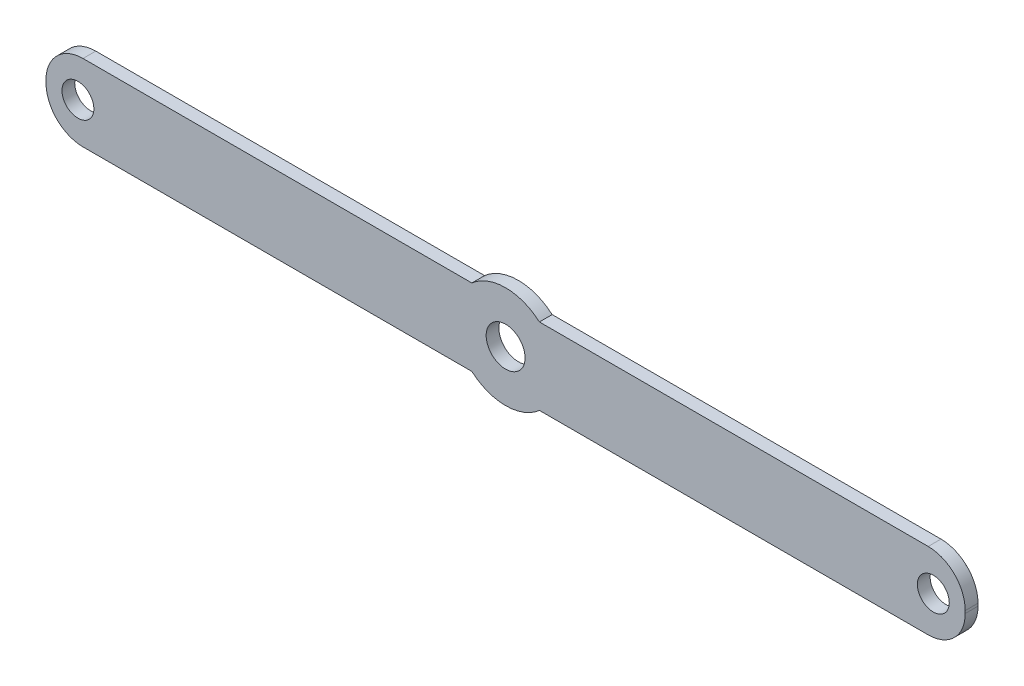
ISO-10303-21;
HEADER;
FILE_DESCRIPTION(('STEP AP214'),'2;1');
FILE_NAME('part.step','',(''),(''),'','','');
FILE_SCHEMA(('AUTOMOTIVE_DESIGN { 1 0 10303 214 1 1 1 1 }'));
ENDSEC;
DATA;
#1=APPLICATION_CONTEXT('core data for automotive mechanical design processes');
#2=APPLICATION_PROTOCOL_DEFINITION('international standard','automotive_design',2000,#1);
#3=PRODUCT_CONTEXT('',#1,'mechanical');
#4=PRODUCT('Part','Part','',(#3));
#5=PRODUCT_RELATED_PRODUCT_CATEGORY('part','',(#4));
#6=PRODUCT_DEFINITION_FORMATION('','',#4);
#7=PRODUCT_DEFINITION_CONTEXT('part definition',#1,'design');
#8=PRODUCT_DEFINITION('design','',#6,#7);
#9=PRODUCT_DEFINITION_SHAPE('','',#8);
#10=(LENGTH_UNIT() NAMED_UNIT(*) SI_UNIT(.MILLI.,.METRE.));
#11=(NAMED_UNIT(*) PLANE_ANGLE_UNIT() SI_UNIT($,.RADIAN.));
#12=(NAMED_UNIT(*) SI_UNIT($,.STERADIAN.) SOLID_ANGLE_UNIT());
#13=UNCERTAINTY_MEASURE_WITH_UNIT(LENGTH_MEASURE(1.E-05),#10,'distance_accuracy_value','');
#14=(GEOMETRIC_REPRESENTATION_CONTEXT(3) GLOBAL_UNCERTAINTY_ASSIGNED_CONTEXT((#13)) GLOBAL_UNIT_ASSIGNED_CONTEXT((#10,
#11,#12)) REPRESENTATION_CONTEXT('',''));
#15=CARTESIAN_POINT('',(0.,0.,0.));
#16=DIRECTION('',(0.,0.,1.));
#17=DIRECTION('',(1.,0.,0.));
#18=AXIS2_PLACEMENT_3D('',#15,#16,#17);
#19=CARTESIAN_POINT('',(360.,-30.,-10.));
#20=DIRECTION('',(0.,0.,1.));
#21=DIRECTION('',(1.,0.,0.));
#22=AXIS2_PLACEMENT_3D('',#19,#20,#21);
#23=CYLINDRICAL_SURFACE('',#22,40.);
#24=CARTESIAN_POINT('',(360.,-30.,0.));
#25=DIRECTION('',(0.,0.,1.));
#26=DIRECTION('',(-1.,0.,0.));
#27=AXIS2_PLACEMENT_3D('',#24,#25,#26);
#28=CIRCLE('',#27,40.);
#29=CARTESIAN_POINT('',(386.457513110646,0.,0.));
#30=VERTEX_POINT('',#29);
#31=CARTESIAN_POINT('',(333.542486889354,0.,0.));
#32=VERTEX_POINT('',#31);
#33=EDGE_CURVE('E160',#30,#32,#28,.T.);
#34=ORIENTED_EDGE('',*,*,#33,.F.);
#35=DIRECTION('',(0.,0.,1.));
#36=VECTOR('',#35,1.);
#37=CARTESIAN_POINT('',(386.457513110646,0.,-10.));
#38=LINE('',#37,#36);
#39=CARTESIAN_POINT('',(386.457513110646,0.,-10.));
#40=VERTEX_POINT('',#39);
#41=EDGE_CURVE('E11',#40,#30,#38,.T.);
#42=ORIENTED_EDGE('',*,*,#41,.F.);
#43=CARTESIAN_POINT('',(360.,-30.,-10.));
#44=DIRECTION('',(0.,0.,1.));
#45=DIRECTION('',(-1.,0.,0.));
#46=AXIS2_PLACEMENT_3D('',#43,#44,#45);
#47=CIRCLE('',#46,40.);
#48=CARTESIAN_POINT('',(333.542486889354,0.,-10.));
#49=VERTEX_POINT('',#48);
#50=EDGE_CURVE('E193',#40,#49,#47,.T.);
#51=ORIENTED_EDGE('',*,*,#50,.T.);
#52=DIRECTION('',(0.,0.,1.));
#53=VECTOR('',#52,1.);
#54=CARTESIAN_POINT('',(333.542486889354,0.,-10.));
#55=LINE('',#54,#53);
#56=EDGE_CURVE('E42',#49,#32,#55,.T.);
#57=ORIENTED_EDGE('',*,*,#56,.T.);
#58=EDGE_LOOP('',(#34,#42,#51,#57));
#59=FACE_BOUND('',#58,.T.);
#60=ADVANCED_FACE('F39',(#59),#23,.T.);
#61=CARTESIAN_POINT('',(386.457513110646,0.,-10.));
#62=DIRECTION('',(0.,1.,0.));
#63=DIRECTION('',(-1.,0.,0.));
#64=AXIS2_PLACEMENT_3D('',#61,#62,#63);
#65=PLANE('',#64);
#66=DIRECTION('',(-1.,0.,0.));
#67=VECTOR('',#66,1.);
#68=CARTESIAN_POINT('',(386.457513110646,0.,0.));
#69=LINE('',#68,#67);
#70=CARTESIAN_POINT('',(691.,0.,0.));
#71=VERTEX_POINT('',#70);
#72=EDGE_CURVE('E191',#71,#30,#69,.T.);
#73=ORIENTED_EDGE('',*,*,#72,.F.);
#74=DIRECTION('',(0.,0.,1.));
#75=VECTOR('',#74,1.);
#76=CARTESIAN_POINT('',(691.,0.,-10.));
#77=LINE('',#76,#75);
#78=CARTESIAN_POINT('',(691.,0.,-10.));
#79=VERTEX_POINT('',#78);
#80=EDGE_CURVE('E48',#79,#71,#77,.T.);
#81=ORIENTED_EDGE('',*,*,#80,.F.);
#82=DIRECTION('',(-1.,0.,0.));
#83=VECTOR('',#82,1.);
#84=CARTESIAN_POINT('',(386.457513110646,0.,-10.));
#85=LINE('',#84,#83);
#86=EDGE_CURVE('E150',#79,#40,#85,.T.);
#87=ORIENTED_EDGE('',*,*,#86,.T.);
#88=ORIENTED_EDGE('',*,*,#41,.T.);
#89=EDGE_LOOP('',(#73,#81,#87,#88));
#90=FACE_BOUND('',#89,.T.);
#91=ADVANCED_FACE('F213',(#90),#65,.T.);
#92=CARTESIAN_POINT('',(691.,-29.,-10.));
#93=DIRECTION('',(0.,0.,1.));
#94=DIRECTION('',(1.,0.,0.));
#95=AXIS2_PLACEMENT_3D('',#92,#93,#94);
#96=CYLINDRICAL_SURFACE('',#95,29.);
#97=CARTESIAN_POINT('',(691.,-29.,0.));
#98=DIRECTION('',(0.,0.,1.));
#99=DIRECTION('',(-1.,0.,0.));
#100=AXIS2_PLACEMENT_3D('',#97,#98,#99);
#101=CIRCLE('',#100,29.);
#102=CARTESIAN_POINT('',(720.,-29.,0.));
#103=VERTEX_POINT('',#102);
#104=EDGE_CURVE('E137',#103,#71,#101,.T.);
#105=ORIENTED_EDGE('',*,*,#104,.F.);
#106=DIRECTION('',(0.,0.,1.));
#107=VECTOR('',#106,1.);
#108=CARTESIAN_POINT('',(720.,-29.,-10.));
#109=LINE('',#108,#107);
#110=CARTESIAN_POINT('',(720.,-29.,-10.));
#111=VERTEX_POINT('',#110);
#112=EDGE_CURVE('E132',#111,#103,#109,.T.);
#113=ORIENTED_EDGE('',*,*,#112,.F.);
#114=CARTESIAN_POINT('',(691.,-29.,-10.));
#115=DIRECTION('',(0.,0.,1.));
#116=DIRECTION('',(-1.,0.,0.));
#117=AXIS2_PLACEMENT_3D('',#114,#115,#116);
#118=CIRCLE('',#117,29.);
#119=EDGE_CURVE('E135',#111,#79,#118,.T.);
#120=ORIENTED_EDGE('',*,*,#119,.T.);
#121=ORIENTED_EDGE('',*,*,#80,.T.);
#122=EDGE_LOOP('',(#105,#113,#120,#121));
#123=FACE_BOUND('',#122,.T.);
#124=ADVANCED_FACE('F134',(#123),#96,.T.);
#125=CARTESIAN_POINT('',(720.,-29.,-10.));
#126=DIRECTION('',(1.,0.,0.));
#127=DIRECTION('',(0.,0.,-1.));
#128=AXIS2_PLACEMENT_3D('',#125,#126,#127);
#129=PLANE('',#128);
#130=DIRECTION('',(0.,1.,0.));
#131=VECTOR('',#130,1.);
#132=CARTESIAN_POINT('',(720.,-29.,0.));
#133=LINE('',#132,#131);
#134=CARTESIAN_POINT('',(720.,-31.,0.));
#135=VERTEX_POINT('',#134);
#136=EDGE_CURVE('E188',#135,#103,#133,.T.);
#137=ORIENTED_EDGE('',*,*,#136,.F.);
#138=DIRECTION('',(0.,0.,1.));
#139=VECTOR('',#138,1.);
#140=CARTESIAN_POINT('',(720.,-31.,-10.));
#141=LINE('',#140,#139);
#142=CARTESIAN_POINT('',(720.,-31.,-10.));
#143=VERTEX_POINT('',#142);
#144=EDGE_CURVE('E142',#143,#135,#141,.T.);
#145=ORIENTED_EDGE('',*,*,#144,.F.);
#146=DIRECTION('',(0.,1.,0.));
#147=VECTOR('',#146,1.);
#148=CARTESIAN_POINT('',(720.,-29.,-10.));
#149=LINE('',#148,#147);
#150=EDGE_CURVE('E148',#143,#111,#149,.T.);
#151=ORIENTED_EDGE('',*,*,#150,.T.);
#152=ORIENTED_EDGE('',*,*,#112,.T.);
#153=EDGE_LOOP('',(#137,#145,#151,#152));
#154=FACE_BOUND('',#153,.T.);
#155=ADVANCED_FACE('F152',(#154),#129,.T.);
#156=CARTESIAN_POINT('',(691.,-31.,-10.));
#157=DIRECTION('',(0.,0.,1.));
#158=DIRECTION('',(1.,0.,0.));
#159=AXIS2_PLACEMENT_3D('',#156,#157,#158);
#160=CYLINDRICAL_SURFACE('',#159,29.);
#161=CARTESIAN_POINT('',(691.,-31.,0.));
#162=DIRECTION('',(0.,0.,1.));
#163=DIRECTION('',(1.,0.,0.));
#164=AXIS2_PLACEMENT_3D('',#161,#162,#163);
#165=CIRCLE('',#164,29.);
#166=CARTESIAN_POINT('',(691.,-60.,0.));
#167=VERTEX_POINT('',#166);
#168=EDGE_CURVE('E185',#167,#135,#165,.T.);
#169=ORIENTED_EDGE('',*,*,#168,.F.);
#170=DIRECTION('',(0.,0.,1.));
#171=VECTOR('',#170,1.);
#172=CARTESIAN_POINT('',(691.,-60.,-10.));
#173=LINE('',#172,#171);
#174=CARTESIAN_POINT('',(691.,-60.,-10.));
#175=VERTEX_POINT('',#174);
#176=EDGE_CURVE('E197',#175,#167,#173,.T.);
#177=ORIENTED_EDGE('',*,*,#176,.F.);
#178=CARTESIAN_POINT('',(691.,-31.,-10.));
#179=DIRECTION('',(0.,0.,1.));
#180=DIRECTION('',(1.,0.,0.));
#181=AXIS2_PLACEMENT_3D('',#178,#179,#180);
#182=CIRCLE('',#181,29.);
#183=EDGE_CURVE('E153',#175,#143,#182,.T.);
#184=ORIENTED_EDGE('',*,*,#183,.T.);
#185=ORIENTED_EDGE('',*,*,#144,.T.);
#186=EDGE_LOOP('',(#169,#177,#184,#185));
#187=FACE_BOUND('',#186,.T.);
#188=ADVANCED_FACE('F226',(#187),#160,.T.);
#189=CARTESIAN_POINT('',(386.457513110646,-60.,-10.));
#190=DIRECTION('',(0.,-1.,0.));
#191=DIRECTION('',(1.,0.,0.));
#192=AXIS2_PLACEMENT_3D('',#189,#190,#191);
#193=PLANE('',#192);
#194=DIRECTION('',(1.,0.,0.));
#195=VECTOR('',#194,1.);
#196=CARTESIAN_POINT('',(386.457513110646,-60.,0.));
#197=LINE('',#196,#195);
#198=CARTESIAN_POINT('',(386.457513110646,-60.,0.));
#199=VERTEX_POINT('',#198);
#200=EDGE_CURVE('E182',#199,#167,#197,.T.);
#201=ORIENTED_EDGE('',*,*,#200,.F.);
#202=DIRECTION('',(0.,0.,1.));
#203=VECTOR('',#202,1.);
#204=CARTESIAN_POINT('',(386.457513110646,-60.,-10.));
#205=LINE('',#204,#203);
#206=CARTESIAN_POINT('',(386.457513110646,-60.,-10.));
#207=VERTEX_POINT('',#206);
#208=EDGE_CURVE('E199',#207,#199,#205,.T.);
#209=ORIENTED_EDGE('',*,*,#208,.F.);
#210=DIRECTION('',(1.,0.,0.));
#211=VECTOR('',#210,1.);
#212=CARTESIAN_POINT('',(386.457513110646,-60.,-10.));
#213=LINE('',#212,#211);
#214=EDGE_CURVE('E155',#207,#175,#213,.T.);
#215=ORIENTED_EDGE('',*,*,#214,.T.);
#216=ORIENTED_EDGE('',*,*,#176,.T.);
#217=EDGE_LOOP('',(#201,#209,#215,#216));
#218=FACE_BOUND('',#217,.T.);
#219=ADVANCED_FACE('F229',(#218),#193,.T.);
#220=CARTESIAN_POINT('',(360.,-30.,-10.));
#221=DIRECTION('',(0.,0.,1.));
#222=DIRECTION('',(1.,0.,0.));
#223=AXIS2_PLACEMENT_3D('',#220,#221,#222);
#224=CYLINDRICAL_SURFACE('',#223,40.);
#225=CARTESIAN_POINT('',(360.,-30.,0.));
#226=DIRECTION('',(0.,0.,1.));
#227=DIRECTION('',(1.,0.,0.));
#228=AXIS2_PLACEMENT_3D('',#225,#226,#227);
#229=CIRCLE('',#228,40.);
#230=CARTESIAN_POINT('',(333.542486889354,-60.,0.));
#231=VERTEX_POINT('',#230);
#232=EDGE_CURVE('E179',#231,#199,#229,.T.);
#233=ORIENTED_EDGE('',*,*,#232,.F.);
#234=DIRECTION('',(0.,0.,1.));
#235=VECTOR('',#234,1.);
#236=CARTESIAN_POINT('',(333.542486889354,-60.,-10.));
#237=LINE('',#236,#235);
#238=CARTESIAN_POINT('',(333.542486889354,-60.,-10.));
#239=VERTEX_POINT('',#238);
#240=EDGE_CURVE('E201',#239,#231,#237,.T.);
#241=ORIENTED_EDGE('',*,*,#240,.F.);
#242=CARTESIAN_POINT('',(360.,-30.,-10.));
#243=DIRECTION('',(0.,0.,1.));
#244=DIRECTION('',(1.,0.,0.));
#245=AXIS2_PLACEMENT_3D('',#242,#243,#244);
#246=CIRCLE('',#245,40.);
#247=EDGE_CURVE('E313',#239,#207,#246,.T.);
#248=ORIENTED_EDGE('',*,*,#247,.T.);
#249=ORIENTED_EDGE('',*,*,#208,.T.);
#250=EDGE_LOOP('',(#233,#241,#248,#249));
#251=FACE_BOUND('',#250,.T.);
#252=ADVANCED_FACE('F233',(#251),#224,.T.);
#253=CARTESIAN_POINT('',(29.0000000000002,-60.,-10.));
#254=DIRECTION('',(0.,-1.,0.));
#255=DIRECTION('',(1.,0.,0.));
#256=AXIS2_PLACEMENT_3D('',#253,#254,#255);
#257=PLANE('',#256);
#258=DIRECTION('',(1.,0.,0.));
#259=VECTOR('',#258,1.);
#260=CARTESIAN_POINT('',(29.0000000000002,-60.,0.));
#261=LINE('',#260,#259);
#262=CARTESIAN_POINT('',(29.0000000000002,-60.,0.));
#263=VERTEX_POINT('',#262);
#264=EDGE_CURVE('E176',#263,#231,#261,.T.);
#265=ORIENTED_EDGE('',*,*,#264,.F.);
#266=DIRECTION('',(0.,0.,1.));
#267=VECTOR('',#266,1.);
#268=CARTESIAN_POINT('',(29.0000000000002,-60.,-10.));
#269=LINE('',#268,#267);
#270=CARTESIAN_POINT('',(29.0000000000002,-60.,-10.));
#271=VERTEX_POINT('',#270);
#272=EDGE_CURVE('E203',#271,#263,#269,.T.);
#273=ORIENTED_EDGE('',*,*,#272,.F.);
#274=DIRECTION('',(1.,0.,0.));
#275=VECTOR('',#274,1.);
#276=CARTESIAN_POINT('',(29.0000000000002,-60.,-10.));
#277=LINE('',#276,#275);
#278=EDGE_CURVE('E310',#271,#239,#277,.T.);
#279=ORIENTED_EDGE('',*,*,#278,.T.);
#280=ORIENTED_EDGE('',*,*,#240,.T.);
#281=EDGE_LOOP('',(#265,#273,#279,#280));
#282=FACE_BOUND('',#281,.T.);
#283=ADVANCED_FACE('F237',(#282),#257,.T.);
#284=CARTESIAN_POINT('',(29.,-31.,-10.));
#285=DIRECTION('',(0.,0.,1.));
#286=DIRECTION('',(1.,0.,0.));
#287=AXIS2_PLACEMENT_3D('',#284,#285,#286);
#288=CYLINDRICAL_SURFACE('',#287,29.);
#289=CARTESIAN_POINT('',(29.,-31.,0.));
#290=DIRECTION('',(0.,0.,1.));
#291=DIRECTION('',(-1.,0.,0.));
#292=AXIS2_PLACEMENT_3D('',#289,#290,#291);
#293=CIRCLE('',#292,29.);
#294=CARTESIAN_POINT('',(0.,-30.9999999999998,0.));
#295=VERTEX_POINT('',#294);
#296=EDGE_CURVE('E173',#295,#263,#293,.T.);
#297=ORIENTED_EDGE('',*,*,#296,.F.);
#298=DIRECTION('',(0.,0.,1.));
#299=VECTOR('',#298,1.);
#300=CARTESIAN_POINT('',(0.,-30.9999999999998,-10.));
#301=LINE('',#300,#299);
#302=CARTESIAN_POINT('',(0.,-30.9999999999998,-10.));
#303=VERTEX_POINT('',#302);
#304=EDGE_CURVE('E205',#303,#295,#301,.T.);
#305=ORIENTED_EDGE('',*,*,#304,.F.);
#306=CARTESIAN_POINT('',(29.,-31.,-10.));
#307=DIRECTION('',(0.,0.,1.));
#308=DIRECTION('',(-1.,0.,0.));
#309=AXIS2_PLACEMENT_3D('',#306,#307,#308);
#310=CIRCLE('',#309,29.);
#311=EDGE_CURVE('E307',#303,#271,#310,.T.);
#312=ORIENTED_EDGE('',*,*,#311,.T.);
#313=ORIENTED_EDGE('',*,*,#272,.T.);
#314=EDGE_LOOP('',(#297,#305,#312,#313));
#315=FACE_BOUND('',#314,.T.);
#316=ADVANCED_FACE('F241',(#315),#288,.T.);
#317=CARTESIAN_POINT('',(0.,-29.0000000000002,-10.));
#318=DIRECTION('',(-1.,0.,0.));
#319=DIRECTION('',(0.,0.,1.));
#320=AXIS2_PLACEMENT_3D('',#317,#318,#319);
#321=PLANE('',#320);
#322=DIRECTION('',(0.,-1.,0.));
#323=VECTOR('',#322,1.);
#324=CARTESIAN_POINT('',(0.,-29.0000000000002,0.));
#325=LINE('',#324,#323);
#326=CARTESIAN_POINT('',(0.,-29.0000000000002,0.));
#327=VERTEX_POINT('',#326);
#328=EDGE_CURVE('E170',#327,#295,#325,.T.);
#329=ORIENTED_EDGE('',*,*,#328,.F.);
#330=DIRECTION('',(0.,0.,1.));
#331=VECTOR('',#330,1.);
#332=CARTESIAN_POINT('',(0.,-29.0000000000002,-10.));
#333=LINE('',#332,#331);
#334=CARTESIAN_POINT('',(0.,-29.0000000000002,-10.));
#335=VERTEX_POINT('',#334);
#336=EDGE_CURVE('E207',#335,#327,#333,.T.);
#337=ORIENTED_EDGE('',*,*,#336,.F.);
#338=DIRECTION('',(0.,-1.,0.));
#339=VECTOR('',#338,1.);
#340=CARTESIAN_POINT('',(0.,-29.0000000000002,-10.));
#341=LINE('',#340,#339);
#342=EDGE_CURVE('E304',#335,#303,#341,.T.);
#343=ORIENTED_EDGE('',*,*,#342,.T.);
#344=ORIENTED_EDGE('',*,*,#304,.T.);
#345=EDGE_LOOP('',(#329,#337,#343,#344));
#346=FACE_BOUND('',#345,.T.);
#347=ADVANCED_FACE('F245',(#346),#321,.T.);
#348=CARTESIAN_POINT('',(29.,-29.,-10.));
#349=DIRECTION('',(0.,0.,1.));
#350=DIRECTION('',(1.,0.,0.));
#351=AXIS2_PLACEMENT_3D('',#348,#349,#350);
#352=CYLINDRICAL_SURFACE('',#351,29.);
#353=CARTESIAN_POINT('',(29.,-29.,0.));
#354=DIRECTION('',(0.,0.,1.));
#355=DIRECTION('',(1.,0.,0.));
#356=AXIS2_PLACEMENT_3D('',#353,#354,#355);
#357=CIRCLE('',#356,29.);
#358=CARTESIAN_POINT('',(29.0000000000002,0.,0.));
#359=VERTEX_POINT('',#358);
#360=EDGE_CURVE('E167',#359,#327,#357,.T.);
#361=ORIENTED_EDGE('',*,*,#360,.F.);
#362=DIRECTION('',(0.,0.,1.));
#363=VECTOR('',#362,1.);
#364=CARTESIAN_POINT('',(29.0000000000002,0.,-10.));
#365=LINE('',#364,#363);
#366=CARTESIAN_POINT('',(29.0000000000002,0.,-10.));
#367=VERTEX_POINT('',#366);
#368=EDGE_CURVE('E208',#367,#359,#365,.T.);
#369=ORIENTED_EDGE('',*,*,#368,.F.);
#370=CARTESIAN_POINT('',(29.,-29.,-10.));
#371=DIRECTION('',(0.,0.,1.));
#372=DIRECTION('',(1.,0.,0.));
#373=AXIS2_PLACEMENT_3D('',#370,#371,#372);
#374=CIRCLE('',#373,29.);
#375=EDGE_CURVE('E301',#367,#335,#374,.T.);
#376=ORIENTED_EDGE('',*,*,#375,.T.);
#377=ORIENTED_EDGE('',*,*,#336,.T.);
#378=EDGE_LOOP('',(#361,#369,#376,#377));
#379=FACE_BOUND('',#378,.T.);
#380=ADVANCED_FACE('F249',(#379),#352,.T.);
#381=CARTESIAN_POINT('',(29.0000000000002,0.,-10.));
#382=DIRECTION('',(0.,1.,0.));
#383=DIRECTION('',(0.,0.,1.));
#384=AXIS2_PLACEMENT_3D('',#381,#382,#383);
#385=PLANE('',#384);
#386=DIRECTION('',(-1.,0.,0.));
#387=VECTOR('',#386,1.);
#388=CARTESIAN_POINT('',(29.0000000000002,0.,0.));
#389=LINE('',#388,#387);
#390=EDGE_CURVE('E163',#32,#359,#389,.T.);
#391=ORIENTED_EDGE('',*,*,#390,.F.);
#392=ORIENTED_EDGE('',*,*,#56,.F.);
#393=DIRECTION('',(-1.,0.,0.));
#394=VECTOR('',#393,1.);
#395=CARTESIAN_POINT('',(29.0000000000002,0.,-10.));
#396=LINE('',#395,#394);
#397=EDGE_CURVE('E299',#49,#367,#396,.T.);
#398=ORIENTED_EDGE('',*,*,#397,.T.);
#399=ORIENTED_EDGE('',*,*,#368,.T.);
#400=EDGE_LOOP('',(#391,#392,#398,#399));
#401=FACE_BOUND('',#400,.T.);
#402=ADVANCED_FACE('F210',(#401),#385,.T.);
#403=CARTESIAN_POINT('',(360.,-30.,-10.));
#404=DIRECTION('',(0.,0.,-1.));
#405=DIRECTION('',(-1.,0.,0.));
#406=AXIS2_PLACEMENT_3D('',#403,#404,#405);
#407=PLANE('',#406);
#408=CARTESIAN_POINT('',(25.,-30.0000000000001,-10.));
#409=DIRECTION('',(0.,0.,1.));
#410=DIRECTION('',(-1.,0.,0.));
#411=AXIS2_PLACEMENT_3D('',#408,#409,#410);
#412=CIRCLE('',#411,12.5);
#413=CARTESIAN_POINT('',(12.5,-30.0000000000001,-10.));
#414=VERTEX_POINT('',#413);
#415=EDGE_CURVE('E280',#414,#414,#412,.T.);
#416=ORIENTED_EDGE('',*,*,#415,.T.);
#417=EDGE_LOOP('',(#416));
#418=FACE_BOUND('',#417,.T.);
#419=CARTESIAN_POINT('',(695.,-30.,-10.));
#420=DIRECTION('',(0.,0.,1.));
#421=DIRECTION('',(1.,0.,0.));
#422=AXIS2_PLACEMENT_3D('',#419,#420,#421);
#423=CIRCLE('',#422,12.5);
#424=CARTESIAN_POINT('',(707.5,-30.,-10.));
#425=VERTEX_POINT('',#424);
#426=EDGE_CURVE('E288',#425,#425,#423,.T.);
#427=ORIENTED_EDGE('',*,*,#426,.T.);
#428=EDGE_LOOP('',(#427));
#429=FACE_BOUND('',#428,.T.);
#430=CARTESIAN_POINT('',(360.,-30.,-10.));
#431=DIRECTION('',(0.,0.,1.));
#432=DIRECTION('',(1.,0.,0.));
#433=AXIS2_PLACEMENT_3D('',#430,#431,#432);
#434=CIRCLE('',#433,15.25);
#435=CARTESIAN_POINT('',(375.25,-30.,-10.));
#436=VERTEX_POINT('',#435);
#437=EDGE_CURVE('E164',#436,#436,#434,.T.);
#438=ORIENTED_EDGE('',*,*,#437,.T.);
#439=EDGE_LOOP('',(#438));
#440=FACE_BOUND('',#439,.T.);
#441=ORIENTED_EDGE('',*,*,#50,.F.);
#442=ORIENTED_EDGE('',*,*,#86,.F.);
#443=ORIENTED_EDGE('',*,*,#119,.F.);
#444=ORIENTED_EDGE('',*,*,#150,.F.);
#445=ORIENTED_EDGE('',*,*,#183,.F.);
#446=ORIENTED_EDGE('',*,*,#214,.F.);
#447=ORIENTED_EDGE('',*,*,#247,.F.);
#448=ORIENTED_EDGE('',*,*,#278,.F.);
#449=ORIENTED_EDGE('',*,*,#311,.F.);
#450=ORIENTED_EDGE('',*,*,#342,.F.);
#451=ORIENTED_EDGE('',*,*,#375,.F.);
#452=ORIENTED_EDGE('',*,*,#397,.F.);
#453=EDGE_LOOP('',(#441,#442,#443,#444,#445,#446,#447,#448,#449,#450,#451,#452));
#454=FACE_BOUND('',#453,.T.);
#455=ADVANCED_FACE('F146',(#418,#429,#440,#454),#407,.T.);
#456=CARTESIAN_POINT('',(360.,-30.,0.));
#457=DIRECTION('',(0.,0.,-1.));
#458=DIRECTION('',(-1.,0.,0.));
#459=AXIS2_PLACEMENT_3D('',#456,#457,#458);
#460=PLANE('',#459);
#461=CARTESIAN_POINT('',(25.,-30.0000000000001,0.));
#462=DIRECTION('',(0.,0.,1.));
#463=DIRECTION('',(-1.,0.,0.));
#464=AXIS2_PLACEMENT_3D('',#461,#462,#463);
#465=CIRCLE('',#464,12.5);
#466=CARTESIAN_POINT('',(12.5,-30.0000000000001,0.));
#467=VERTEX_POINT('',#466);
#468=EDGE_CURVE('E283',#467,#467,#465,.T.);
#469=ORIENTED_EDGE('',*,*,#468,.F.);
#470=EDGE_LOOP('',(#469));
#471=FACE_BOUND('',#470,.T.);
#472=CARTESIAN_POINT('',(695.,-30.,0.));
#473=DIRECTION('',(0.,0.,1.));
#474=DIRECTION('',(1.,0.,0.));
#475=AXIS2_PLACEMENT_3D('',#472,#473,#474);
#476=CIRCLE('',#475,12.5);
#477=CARTESIAN_POINT('',(707.5,-30.,0.));
#478=VERTEX_POINT('',#477);
#479=EDGE_CURVE('E285',#478,#478,#476,.T.);
#480=ORIENTED_EDGE('',*,*,#479,.F.);
#481=EDGE_LOOP('',(#480));
#482=FACE_BOUND('',#481,.T.);
#483=CARTESIAN_POINT('',(360.,-30.,0.));
#484=DIRECTION('',(0.,0.,1.));
#485=DIRECTION('',(1.,0.,0.));
#486=AXIS2_PLACEMENT_3D('',#483,#484,#485);
#487=CIRCLE('',#486,15.25);
#488=CARTESIAN_POINT('',(375.25,-30.,0.));
#489=VERTEX_POINT('',#488);
#490=EDGE_CURVE('E291',#489,#489,#487,.T.);
#491=ORIENTED_EDGE('',*,*,#490,.F.);
#492=EDGE_LOOP('',(#491));
#493=FACE_BOUND('',#492,.T.);
#494=ORIENTED_EDGE('',*,*,#33,.T.);
#495=ORIENTED_EDGE('',*,*,#390,.T.);
#496=ORIENTED_EDGE('',*,*,#360,.T.);
#497=ORIENTED_EDGE('',*,*,#328,.T.);
#498=ORIENTED_EDGE('',*,*,#296,.T.);
#499=ORIENTED_EDGE('',*,*,#264,.T.);
#500=ORIENTED_EDGE('',*,*,#232,.T.);
#501=ORIENTED_EDGE('',*,*,#200,.T.);
#502=ORIENTED_EDGE('',*,*,#168,.T.);
#503=ORIENTED_EDGE('',*,*,#136,.T.);
#504=ORIENTED_EDGE('',*,*,#104,.T.);
#505=ORIENTED_EDGE('',*,*,#72,.T.);
#506=EDGE_LOOP('',(#494,#495,#496,#497,#498,#499,#500,#501,#502,#503,#504,#505));
#507=FACE_BOUND('',#506,.T.);
#508=ADVANCED_FACE('F212',(#471,#482,#493,#507),#460,.F.);
#509=CARTESIAN_POINT('',(360.,-30.,-10.));
#510=DIRECTION('',(0.,0.,1.));
#511=DIRECTION('',(1.,0.,0.));
#512=AXIS2_PLACEMENT_3D('',#509,#510,#511);
#513=CYLINDRICAL_SURFACE('',#512,15.25);
#514=ORIENTED_EDGE('',*,*,#437,.F.);
#515=EDGE_LOOP('',(#514));
#516=FACE_BOUND('',#515,.T.);
#517=ORIENTED_EDGE('',*,*,#490,.T.);
#518=EDGE_LOOP('',(#517));
#519=FACE_BOUND('',#518,.T.);
#520=ADVANCED_FACE('F261',(#516,#519),#513,.F.);
#521=CARTESIAN_POINT('',(695.,-30.,-10.));
#522=DIRECTION('',(0.,0.,1.));
#523=DIRECTION('',(1.,0.,0.));
#524=AXIS2_PLACEMENT_3D('',#521,#522,#523);
#525=CYLINDRICAL_SURFACE('',#524,12.5);
#526=ORIENTED_EDGE('',*,*,#426,.F.);
#527=EDGE_LOOP('',(#526));
#528=FACE_BOUND('',#527,.T.);
#529=ORIENTED_EDGE('',*,*,#479,.T.);
#530=EDGE_LOOP('',(#529));
#531=FACE_BOUND('',#530,.T.);
#532=ADVANCED_FACE('F268',(#528,#531),#525,.F.);
#533=CARTESIAN_POINT('',(25.,-30.0000000000001,-10.));
#534=DIRECTION('',(0.,0.,1.));
#535=DIRECTION('',(1.,0.,0.));
#536=AXIS2_PLACEMENT_3D('',#533,#534,#535);
#537=CYLINDRICAL_SURFACE('',#536,12.5);
#538=ORIENTED_EDGE('',*,*,#415,.F.);
#539=EDGE_LOOP('',(#538));
#540=FACE_BOUND('',#539,.T.);
#541=ORIENTED_EDGE('',*,*,#468,.T.);
#542=EDGE_LOOP('',(#541));
#543=FACE_BOUND('',#542,.T.);
#544=ADVANCED_FACE('F272',(#540,#543),#537,.F.);
#545=CLOSED_SHELL('',(#60,#91,#124,#155,#188,#219,#252,#283,#316,#347,#380,#402,#455,#508,#520,
#532,#544));
#546=MANIFOLD_SOLID_BREP('B2',#545);
#547=ADVANCED_BREP_SHAPE_REPRESENTATION('',(#18,#546),#14);
#548=SHAPE_DEFINITION_REPRESENTATION(#9,#547);
ENDSEC;
END-ISO-10303-21;
